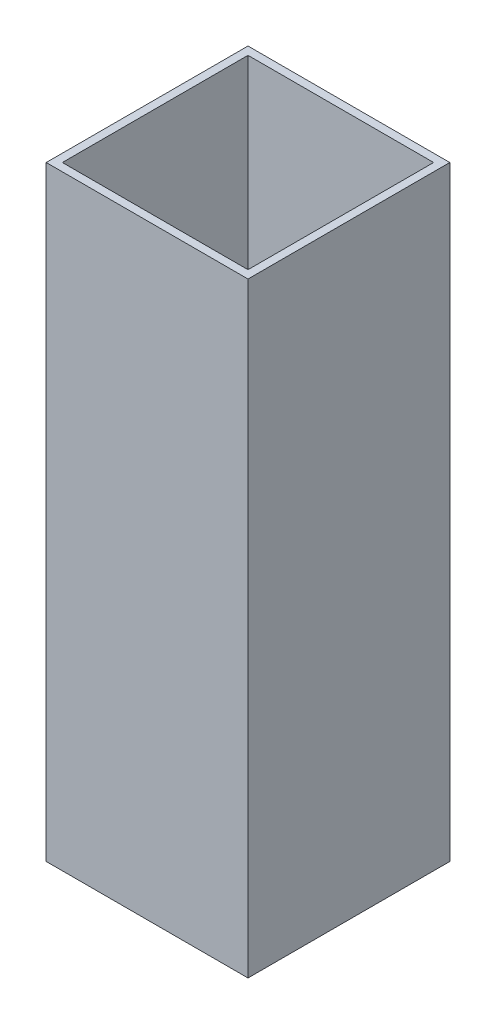
ISO-10303-21;
HEADER;
FILE_DESCRIPTION(('STEP AP214'),'2;1');
FILE_NAME('part.step','',(''),(''),'','','');
FILE_SCHEMA(('AUTOMOTIVE_DESIGN { 1 0 10303 214 1 1 1 1 }'));
ENDSEC;
DATA;
#1=APPLICATION_CONTEXT('core data for automotive mechanical design processes');
#2=APPLICATION_PROTOCOL_DEFINITION('international standard','automotive_design',2000,#1);
#3=PRODUCT_CONTEXT('',#1,'mechanical');
#4=PRODUCT('Part','Part','',(#3));
#5=PRODUCT_RELATED_PRODUCT_CATEGORY('part','',(#4));
#6=PRODUCT_DEFINITION_FORMATION('','',#4);
#7=PRODUCT_DEFINITION_CONTEXT('part definition',#1,'design');
#8=PRODUCT_DEFINITION('design','',#6,#7);
#9=PRODUCT_DEFINITION_SHAPE('','',#8);
#10=(LENGTH_UNIT() NAMED_UNIT(*) SI_UNIT(.MILLI.,.METRE.));
#11=(NAMED_UNIT(*) PLANE_ANGLE_UNIT() SI_UNIT($,.RADIAN.));
#12=(NAMED_UNIT(*) SI_UNIT($,.STERADIAN.) SOLID_ANGLE_UNIT());
#13=UNCERTAINTY_MEASURE_WITH_UNIT(LENGTH_MEASURE(1.E-05),#10,'distance_accuracy_value','');
#14=(GEOMETRIC_REPRESENTATION_CONTEXT(3) GLOBAL_UNCERTAINTY_ASSIGNED_CONTEXT((#13)) GLOBAL_UNIT_ASSIGNED_CONTEXT((#10,
#11,#12)) REPRESENTATION_CONTEXT('',''));
#15=CARTESIAN_POINT('',(0.,0.,0.));
#16=DIRECTION('',(0.,0.,1.));
#17=DIRECTION('',(1.,0.,0.));
#18=AXIS2_PLACEMENT_3D('',#15,#16,#17);
#19=CARTESIAN_POINT('',(0.,150.,0.));
#20=DIRECTION('',(0.,-1.,0.));
#21=DIRECTION('',(0.,0.,-1.));
#22=AXIS2_PLACEMENT_3D('',#19,#20,#21);
#23=PLANE('',#22);
#24=DIRECTION('',(0.,0.,-1.));
#25=VECTOR('',#24,1.);
#26=CARTESIAN_POINT('',(25.,150.,25.));
#27=LINE('',#26,#25);
#28=CARTESIAN_POINT('',(25.,150.,25.));
#29=VERTEX_POINT('',#28);
#30=CARTESIAN_POINT('',(25.,150.,-25.));
#31=VERTEX_POINT('',#30);
#32=EDGE_CURVE('E153',#29,#31,#27,.T.);
#33=ORIENTED_EDGE('',*,*,#32,.T.);
#34=DIRECTION('',(-1.,0.,0.));
#35=VECTOR('',#34,1.);
#36=CARTESIAN_POINT('',(-25.,150.,-25.));
#37=LINE('',#36,#35);
#38=CARTESIAN_POINT('',(-25.,150.,-25.));
#39=VERTEX_POINT('',#38);
#40=EDGE_CURVE('E157',#31,#39,#37,.T.);
#41=ORIENTED_EDGE('',*,*,#40,.T.);
#42=DIRECTION('',(0.,0.,1.));
#43=VECTOR('',#42,1.);
#44=CARTESIAN_POINT('',(-25.,150.,25.));
#45=LINE('',#44,#43);
#46=CARTESIAN_POINT('',(-25.,150.,25.));
#47=VERTEX_POINT('',#46);
#48=EDGE_CURVE('E161',#39,#47,#45,.T.);
#49=ORIENTED_EDGE('',*,*,#48,.T.);
#50=DIRECTION('',(1.,0.,0.));
#51=VECTOR('',#50,1.);
#52=CARTESIAN_POINT('',(-25.,150.,25.));
#53=LINE('',#52,#51);
#54=EDGE_CURVE('E164',#47,#29,#53,.T.);
#55=ORIENTED_EDGE('',*,*,#54,.T.);
#56=EDGE_LOOP('',(#33,#41,#49,#55));
#57=FACE_BOUND('',#56,.T.);
#58=DIRECTION('',(0.,0.,1.));
#59=VECTOR('',#58,1.);
#60=CARTESIAN_POINT('',(-23.,150.,23.));
#61=LINE('',#60,#59);
#62=CARTESIAN_POINT('',(-23.,150.,-23.));
#63=VERTEX_POINT('',#62);
#64=CARTESIAN_POINT('',(-23.,150.,23.));
#65=VERTEX_POINT('',#64);
#66=EDGE_CURVE('E105',#63,#65,#61,.T.);
#67=ORIENTED_EDGE('',*,*,#66,.F.);
#68=DIRECTION('',(-1.,0.,0.));
#69=VECTOR('',#68,1.);
#70=CARTESIAN_POINT('',(-23.,150.,-23.));
#71=LINE('',#70,#69);
#72=CARTESIAN_POINT('',(23.,150.,-23.));
#73=VERTEX_POINT('',#72);
#74=EDGE_CURVE('E131',#73,#63,#71,.T.);
#75=ORIENTED_EDGE('',*,*,#74,.F.);
#76=DIRECTION('',(0.,0.,-1.));
#77=VECTOR('',#76,1.);
#78=CARTESIAN_POINT('',(23.,150.,23.));
#79=LINE('',#78,#77);
#80=CARTESIAN_POINT('',(23.,150.,23.));
#81=VERTEX_POINT('',#80);
#82=EDGE_CURVE('E127',#81,#73,#79,.T.);
#83=ORIENTED_EDGE('',*,*,#82,.F.);
#84=DIRECTION('',(1.,0.,0.));
#85=VECTOR('',#84,1.);
#86=CARTESIAN_POINT('',(-23.,150.,23.));
#87=LINE('',#86,#85);
#88=EDGE_CURVE('E114',#65,#81,#87,.T.);
#89=ORIENTED_EDGE('',*,*,#88,.F.);
#90=EDGE_LOOP('',(#67,#75,#83,#89));
#91=FACE_BOUND('',#90,.T.);
#92=ADVANCED_FACE('F39',(#57,#91),#23,.F.);
#93=CARTESIAN_POINT('',(0.,0.,0.));
#94=DIRECTION('',(0.,-1.,0.));
#95=DIRECTION('',(0.,0.,-1.));
#96=AXIS2_PLACEMENT_3D('',#93,#94,#95);
#97=PLANE('',#96);
#98=DIRECTION('',(0.,0.,-1.));
#99=VECTOR('',#98,1.);
#100=CARTESIAN_POINT('',(25.,0.,25.));
#101=LINE('',#100,#99);
#102=CARTESIAN_POINT('',(25.,0.,25.));
#103=VERTEX_POINT('',#102);
#104=CARTESIAN_POINT('',(25.,0.,-25.));
#105=VERTEX_POINT('',#104);
#106=EDGE_CURVE('E123',#103,#105,#101,.T.);
#107=ORIENTED_EDGE('',*,*,#106,.F.);
#108=DIRECTION('',(1.,0.,0.));
#109=VECTOR('',#108,1.);
#110=CARTESIAN_POINT('',(-25.,0.,25.));
#111=LINE('',#110,#109);
#112=CARTESIAN_POINT('',(-25.,0.,25.));
#113=VERTEX_POINT('',#112);
#114=EDGE_CURVE('E158',#113,#103,#111,.T.);
#115=ORIENTED_EDGE('',*,*,#114,.F.);
#116=DIRECTION('',(0.,0.,1.));
#117=VECTOR('',#116,1.);
#118=CARTESIAN_POINT('',(-25.,0.,25.));
#119=LINE('',#118,#117);
#120=CARTESIAN_POINT('',(-25.,0.,-25.));
#121=VERTEX_POINT('',#120);
#122=EDGE_CURVE('E174',#121,#113,#119,.T.);
#123=ORIENTED_EDGE('',*,*,#122,.F.);
#124=DIRECTION('',(-1.,0.,0.));
#125=VECTOR('',#124,1.);
#126=CARTESIAN_POINT('',(-25.,0.,-25.));
#127=LINE('',#126,#125);
#128=EDGE_CURVE('E171',#105,#121,#127,.T.);
#129=ORIENTED_EDGE('',*,*,#128,.F.);
#130=EDGE_LOOP('',(#107,#115,#123,#129));
#131=FACE_BOUND('',#130,.T.);
#132=DIRECTION('',(-1.,0.,0.));
#133=VECTOR('',#132,1.);
#134=CARTESIAN_POINT('',(-23.,0.,-23.));
#135=LINE('',#134,#133);
#136=CARTESIAN_POINT('',(23.,0.,-23.));
#137=VERTEX_POINT('',#136);
#138=CARTESIAN_POINT('',(-23.,0.,-23.));
#139=VERTEX_POINT('',#138);
#140=EDGE_CURVE('E115',#137,#139,#135,.T.);
#141=ORIENTED_EDGE('',*,*,#140,.T.);
#142=DIRECTION('',(0.,0.,1.));
#143=VECTOR('',#142,1.);
#144=CARTESIAN_POINT('',(-23.,0.,23.));
#145=LINE('',#144,#143);
#146=CARTESIAN_POINT('',(-23.,0.,23.));
#147=VERTEX_POINT('',#146);
#148=EDGE_CURVE('E63',#139,#147,#145,.T.);
#149=ORIENTED_EDGE('',*,*,#148,.T.);
#150=DIRECTION('',(1.,0.,0.));
#151=VECTOR('',#150,1.);
#152=CARTESIAN_POINT('',(-23.,0.,23.));
#153=LINE('',#152,#151);
#154=CARTESIAN_POINT('',(23.,0.,23.));
#155=VERTEX_POINT('',#154);
#156=EDGE_CURVE('E121',#147,#155,#153,.T.);
#157=ORIENTED_EDGE('',*,*,#156,.T.);
#158=DIRECTION('',(0.,0.,-1.));
#159=VECTOR('',#158,1.);
#160=CARTESIAN_POINT('',(23.,0.,23.));
#161=LINE('',#160,#159);
#162=EDGE_CURVE('E140',#155,#137,#161,.T.);
#163=ORIENTED_EDGE('',*,*,#162,.T.);
#164=EDGE_LOOP('',(#141,#149,#157,#163));
#165=FACE_BOUND('',#164,.T.);
#166=ADVANCED_FACE('F197',(#131,#165),#97,.T.);
#167=CARTESIAN_POINT('',(25.,150.,25.));
#168=DIRECTION('',(-1.,0.,0.));
#169=DIRECTION('',(0.,0.,1.));
#170=AXIS2_PLACEMENT_3D('',#167,#168,#169);
#171=PLANE('',#170);
#172=ORIENTED_EDGE('',*,*,#106,.T.);
#173=DIRECTION('',(0.,-1.,0.));
#174=VECTOR('',#173,1.);
#175=CARTESIAN_POINT('',(25.,150.,-25.));
#176=LINE('',#175,#174);
#177=EDGE_CURVE('E11',#31,#105,#176,.T.);
#178=ORIENTED_EDGE('',*,*,#177,.F.);
#179=ORIENTED_EDGE('',*,*,#32,.F.);
#180=DIRECTION('',(0.,-1.,0.));
#181=VECTOR('',#180,1.);
#182=CARTESIAN_POINT('',(25.,150.,25.));
#183=LINE('',#182,#181);
#184=EDGE_CURVE('E167',#29,#103,#183,.T.);
#185=ORIENTED_EDGE('',*,*,#184,.T.);
#186=EDGE_LOOP('',(#172,#178,#179,#185));
#187=FACE_BOUND('',#186,.T.);
#188=ADVANCED_FACE('F41',(#187),#171,.F.);
#189=CARTESIAN_POINT('',(-25.,150.,-25.));
#190=DIRECTION('',(0.,0.,1.));
#191=DIRECTION('',(1.,0.,0.));
#192=AXIS2_PLACEMENT_3D('',#189,#190,#191);
#193=PLANE('',#192);
#194=ORIENTED_EDGE('',*,*,#128,.T.);
#195=DIRECTION('',(0.,-1.,0.));
#196=VECTOR('',#195,1.);
#197=CARTESIAN_POINT('',(-25.,150.,-25.));
#198=LINE('',#197,#196);
#199=EDGE_CURVE('E48',#39,#121,#198,.T.);
#200=ORIENTED_EDGE('',*,*,#199,.F.);
#201=ORIENTED_EDGE('',*,*,#40,.F.);
#202=ORIENTED_EDGE('',*,*,#177,.T.);
#203=EDGE_LOOP('',(#194,#200,#201,#202));
#204=FACE_BOUND('',#203,.T.);
#205=ADVANCED_FACE('F207',(#204),#193,.F.);
#206=CARTESIAN_POINT('',(-25.,150.,25.));
#207=DIRECTION('',(1.,0.,0.));
#208=DIRECTION('',(0.,0.,-1.));
#209=AXIS2_PLACEMENT_3D('',#206,#207,#208);
#210=PLANE('',#209);
#211=ORIENTED_EDGE('',*,*,#122,.T.);
#212=DIRECTION('',(0.,-1.,0.));
#213=VECTOR('',#212,1.);
#214=CARTESIAN_POINT('',(-25.,150.,25.));
#215=LINE('',#214,#213);
#216=EDGE_CURVE('E182',#47,#113,#215,.T.);
#217=ORIENTED_EDGE('',*,*,#216,.F.);
#218=ORIENTED_EDGE('',*,*,#48,.F.);
#219=ORIENTED_EDGE('',*,*,#199,.T.);
#220=EDGE_LOOP('',(#211,#217,#218,#219));
#221=FACE_BOUND('',#220,.T.);
#222=ADVANCED_FACE('F191',(#221),#210,.F.);
#223=CARTESIAN_POINT('',(-25.,150.,25.));
#224=DIRECTION('',(0.,0.,-1.));
#225=DIRECTION('',(-1.,0.,0.));
#226=AXIS2_PLACEMENT_3D('',#223,#224,#225);
#227=PLANE('',#226);
#228=ORIENTED_EDGE('',*,*,#114,.T.);
#229=ORIENTED_EDGE('',*,*,#184,.F.);
#230=ORIENTED_EDGE('',*,*,#54,.F.);
#231=ORIENTED_EDGE('',*,*,#216,.T.);
#232=EDGE_LOOP('',(#228,#229,#230,#231));
#233=FACE_BOUND('',#232,.T.);
#234=ADVANCED_FACE('F201',(#233),#227,.F.);
#235=CARTESIAN_POINT('',(-23.,150.,23.));
#236=DIRECTION('',(1.,0.,0.));
#237=DIRECTION('',(0.,0.,-1.));
#238=AXIS2_PLACEMENT_3D('',#235,#236,#237);
#239=PLANE('',#238);
#240=ORIENTED_EDGE('',*,*,#148,.F.);
#241=DIRECTION('',(0.,-1.,0.));
#242=VECTOR('',#241,1.);
#243=CARTESIAN_POINT('',(-23.,150.,-23.));
#244=LINE('',#243,#242);
#245=EDGE_CURVE('E109',#63,#139,#244,.T.);
#246=ORIENTED_EDGE('',*,*,#245,.F.);
#247=ORIENTED_EDGE('',*,*,#66,.T.);
#248=DIRECTION('',(0.,-1.,0.));
#249=VECTOR('',#248,1.);
#250=CARTESIAN_POINT('',(-23.,150.,23.));
#251=LINE('',#250,#249);
#252=EDGE_CURVE('E108',#65,#147,#251,.T.);
#253=ORIENTED_EDGE('',*,*,#252,.T.);
#254=EDGE_LOOP('',(#240,#246,#247,#253));
#255=FACE_BOUND('',#254,.T.);
#256=ADVANCED_FACE('F107',(#255),#239,.T.);
#257=CARTESIAN_POINT('',(-23.,150.,23.));
#258=DIRECTION('',(0.,0.,-1.));
#259=DIRECTION('',(-1.,0.,0.));
#260=AXIS2_PLACEMENT_3D('',#257,#258,#259);
#261=PLANE('',#260);
#262=ORIENTED_EDGE('',*,*,#156,.F.);
#263=ORIENTED_EDGE('',*,*,#252,.F.);
#264=ORIENTED_EDGE('',*,*,#88,.T.);
#265=DIRECTION('',(0.,-1.,0.));
#266=VECTOR('',#265,1.);
#267=CARTESIAN_POINT('',(23.,150.,23.));
#268=LINE('',#267,#266);
#269=EDGE_CURVE('E124',#81,#155,#268,.T.);
#270=ORIENTED_EDGE('',*,*,#269,.T.);
#271=EDGE_LOOP('',(#262,#263,#264,#270));
#272=FACE_BOUND('',#271,.T.);
#273=ADVANCED_FACE('F118',(#272),#261,.T.);
#274=CARTESIAN_POINT('',(23.,150.,23.));
#275=DIRECTION('',(-1.,0.,0.));
#276=DIRECTION('',(0.,0.,1.));
#277=AXIS2_PLACEMENT_3D('',#274,#275,#276);
#278=PLANE('',#277);
#279=ORIENTED_EDGE('',*,*,#162,.F.);
#280=ORIENTED_EDGE('',*,*,#269,.F.);
#281=ORIENTED_EDGE('',*,*,#82,.T.);
#282=DIRECTION('',(0.,-1.,0.));
#283=VECTOR('',#282,1.);
#284=CARTESIAN_POINT('',(23.,150.,-23.));
#285=LINE('',#284,#283);
#286=EDGE_CURVE('E55',#73,#137,#285,.T.);
#287=ORIENTED_EDGE('',*,*,#286,.T.);
#288=EDGE_LOOP('',(#279,#280,#281,#287));
#289=FACE_BOUND('',#288,.T.);
#290=ADVANCED_FACE('F230',(#289),#278,.T.);
#291=CARTESIAN_POINT('',(-23.,150.,-23.));
#292=DIRECTION('',(0.,0.,1.));
#293=DIRECTION('',(1.,0.,0.));
#294=AXIS2_PLACEMENT_3D('',#291,#292,#293);
#295=PLANE('',#294);
#296=ORIENTED_EDGE('',*,*,#140,.F.);
#297=ORIENTED_EDGE('',*,*,#286,.F.);
#298=ORIENTED_EDGE('',*,*,#74,.T.);
#299=ORIENTED_EDGE('',*,*,#245,.T.);
#300=EDGE_LOOP('',(#296,#297,#298,#299));
#301=FACE_BOUND('',#300,.T.);
#302=ADVANCED_FACE('F234',(#301),#295,.T.);
#303=CLOSED_SHELL('',(#92,#166,#188,#205,#222,#234,#256,#273,#290,#302));
#304=MANIFOLD_SOLID_BREP('B2',#303);
#305=ADVANCED_BREP_SHAPE_REPRESENTATION('',(#18,#304),#14);
#306=SHAPE_DEFINITION_REPRESENTATION(#9,#305);
ENDSEC;
END-ISO-10303-21;
